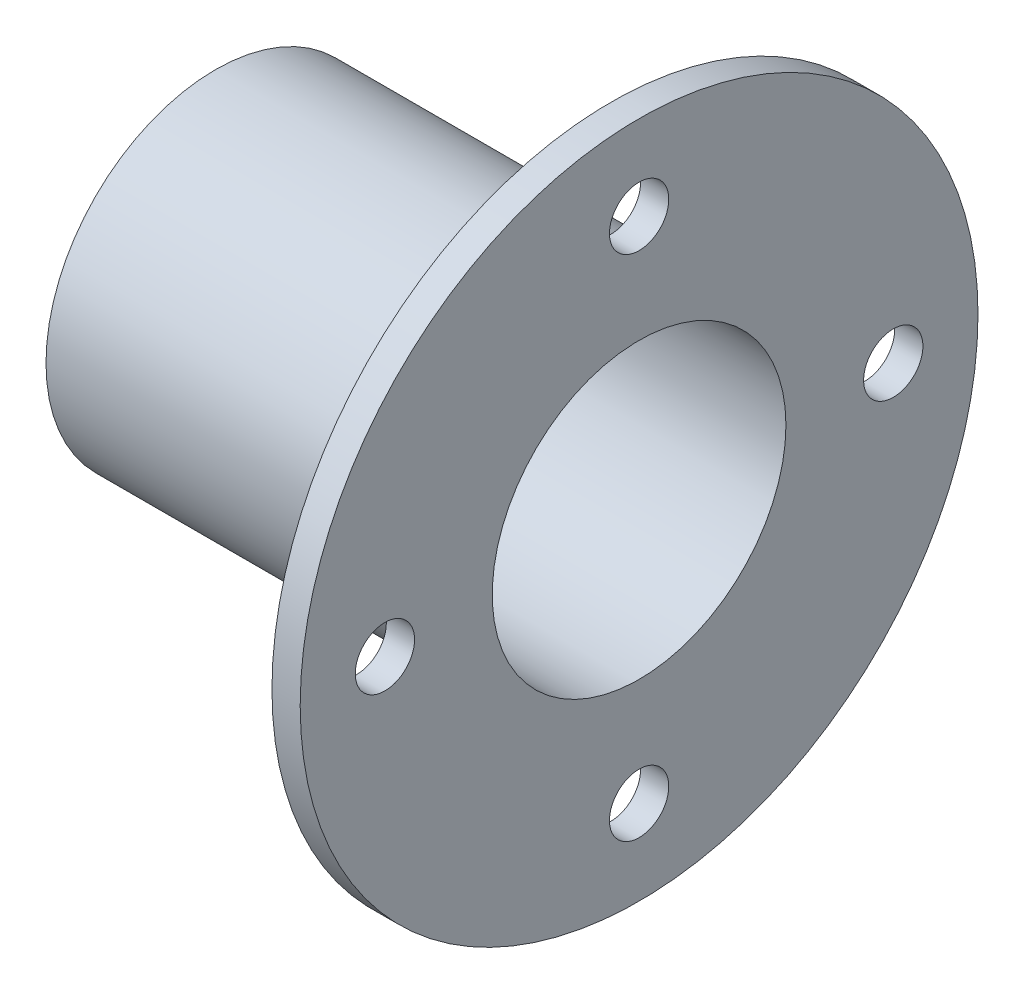
ISO-10303-21;
HEADER;
FILE_DESCRIPTION(('STEP AP214'),'2;1');
FILE_NAME('part.step','',(''),(''),'','','');
FILE_SCHEMA(('AUTOMOTIVE_DESIGN { 1 0 10303 214 1 1 1 1 }'));
ENDSEC;
DATA;
#1=APPLICATION_CONTEXT('core data for automotive mechanical design processes');
#2=APPLICATION_PROTOCOL_DEFINITION('international standard','automotive_design',2000,#1);
#3=PRODUCT_CONTEXT('',#1,'mechanical');
#4=PRODUCT('Part','Part','',(#3));
#5=PRODUCT_RELATED_PRODUCT_CATEGORY('part','',(#4));
#6=PRODUCT_DEFINITION_FORMATION('','',#4);
#7=PRODUCT_DEFINITION_CONTEXT('part definition',#1,'design');
#8=PRODUCT_DEFINITION('design','',#6,#7);
#9=PRODUCT_DEFINITION_SHAPE('','',#8);
#10=(LENGTH_UNIT() NAMED_UNIT(*) SI_UNIT(.MILLI.,.METRE.));
#11=(NAMED_UNIT(*) PLANE_ANGLE_UNIT() SI_UNIT($,.RADIAN.));
#12=(NAMED_UNIT(*) SI_UNIT($,.STERADIAN.) SOLID_ANGLE_UNIT());
#13=UNCERTAINTY_MEASURE_WITH_UNIT(LENGTH_MEASURE(1.E-05),#10,'distance_accuracy_value','');
#14=(GEOMETRIC_REPRESENTATION_CONTEXT(3) GLOBAL_UNCERTAINTY_ASSIGNED_CONTEXT((#13)) GLOBAL_UNIT_ASSIGNED_CONTEXT((#10,
#11,#12)) REPRESENTATION_CONTEXT('',''));
#15=CARTESIAN_POINT('',(0.,0.,0.));
#16=DIRECTION('',(0.,0.,1.));
#17=DIRECTION('',(1.,0.,0.));
#18=AXIS2_PLACEMENT_3D('',#15,#16,#17);
#19=CARTESIAN_POINT('',(0.,0.,0.));
#20=DIRECTION('',(1.,0.,0.));
#21=DIRECTION('',(0.,0.,-1.));
#22=AXIS2_PLACEMENT_3D('',#19,#20,#21);
#23=PLANE('',#22);
#24=CARTESIAN_POINT('',(0.,0.,0.));
#25=DIRECTION('',(1.,0.,0.));
#26=DIRECTION('',(0.,0.,-1.));
#27=AXIS2_PLACEMENT_3D('',#24,#25,#26);
#28=CIRCLE('',#27,30.);
#29=CARTESIAN_POINT('',(0.,0.,-30.));
#30=VERTEX_POINT('',#29);
#31=EDGE_CURVE('E34',#30,#30,#28,.T.);
#32=ORIENTED_EDGE('',*,*,#31,.F.);
#33=EDGE_LOOP('',(#32));
#34=FACE_BOUND('',#33,.T.);
#35=CARTESIAN_POINT('',(0.,0.,0.));
#36=DIRECTION('',(1.,0.,0.));
#37=DIRECTION('',(0.,0.,-1.));
#38=AXIS2_PLACEMENT_3D('',#35,#36,#37);
#39=CIRCLE('',#38,26.);
#40=CARTESIAN_POINT('',(0.,0.,-26.));
#41=VERTEX_POINT('',#40);
#42=EDGE_CURVE('E41',#41,#41,#39,.T.);
#43=ORIENTED_EDGE('',*,*,#42,.T.);
#44=EDGE_LOOP('',(#43));
#45=FACE_BOUND('',#44,.T.);
#46=ADVANCED_FACE('F30',(#34,#45),#23,.F.);
#47=CARTESIAN_POINT('',(70.,0.,0.));
#48=DIRECTION('',(-1.,0.,0.));
#49=DIRECTION('',(0.,0.,1.));
#50=AXIS2_PLACEMENT_3D('',#47,#48,#49);
#51=CYLINDRICAL_SURFACE('',#50,30.);
#52=CARTESIAN_POINT('',(70.,0.,0.));
#53=DIRECTION('',(1.,0.,0.));
#54=DIRECTION('',(0.,0.,-1.));
#55=AXIS2_PLACEMENT_3D('',#52,#53,#54);
#56=CIRCLE('',#55,30.);
#57=CARTESIAN_POINT('',(70.,0.,-30.));
#58=VERTEX_POINT('',#57);
#59=EDGE_CURVE('E10',#58,#58,#56,.T.);
#60=ORIENTED_EDGE('',*,*,#59,.F.);
#61=EDGE_LOOP('',(#60));
#62=FACE_BOUND('',#61,.T.);
#63=ORIENTED_EDGE('',*,*,#31,.T.);
#64=EDGE_LOOP('',(#63));
#65=FACE_BOUND('',#64,.T.);
#66=ADVANCED_FACE('F32',(#62,#65),#51,.T.);
#67=CARTESIAN_POINT('',(70.,0.,0.));
#68=DIRECTION('',(-1.,0.,0.));
#69=DIRECTION('',(0.,0.,1.));
#70=AXIS2_PLACEMENT_3D('',#67,#68,#69);
#71=CYLINDRICAL_SURFACE('',#70,26.);
#72=ORIENTED_EDGE('',*,*,#42,.F.);
#73=EDGE_LOOP('',(#72));
#74=FACE_BOUND('',#73,.T.);
#75=CARTESIAN_POINT('',(75.,0.,0.));
#76=DIRECTION('',(1.,0.,0.));
#77=DIRECTION('',(0.,0.,-1.));
#78=AXIS2_PLACEMENT_3D('',#75,#76,#77);
#79=CIRCLE('',#78,26.);
#80=CARTESIAN_POINT('',(75.,0.,-26.));
#81=VERTEX_POINT('',#80);
#82=EDGE_CURVE('E49',#81,#81,#79,.T.);
#83=ORIENTED_EDGE('',*,*,#82,.T.);
#84=EDGE_LOOP('',(#83));
#85=FACE_BOUND('',#84,.T.);
#86=ADVANCED_FACE('F97',(#74,#85),#71,.F.);
#87=CARTESIAN_POINT('',(70.,0.,0.));
#88=DIRECTION('',(1.,0.,0.));
#89=DIRECTION('',(0.,0.,-1.));
#90=AXIS2_PLACEMENT_3D('',#87,#88,#89);
#91=PLANE('',#90);
#92=CARTESIAN_POINT('',(70.,0.,-45.));
#93=DIRECTION('',(1.,0.,0.));
#94=DIRECTION('',(0.,0.,-1.));
#95=AXIS2_PLACEMENT_3D('',#92,#93,#94);
#96=CIRCLE('',#95,5.25);
#97=CARTESIAN_POINT('',(70.,0.,-50.25));
#98=VERTEX_POINT('',#97);
#99=EDGE_CURVE('E60',#98,#98,#96,.F.);
#100=ORIENTED_EDGE('',*,*,#99,.F.);
#101=EDGE_LOOP('',(#100));
#102=FACE_BOUND('',#101,.T.);
#103=CARTESIAN_POINT('',(70.,-45.,0.));
#104=DIRECTION('',(1.,0.,0.));
#105=DIRECTION('',(0.,0.,-1.));
#106=AXIS2_PLACEMENT_3D('',#103,#104,#105);
#107=CIRCLE('',#106,5.25);
#108=CARTESIAN_POINT('',(70.,-45.,-5.25));
#109=VERTEX_POINT('',#108);
#110=EDGE_CURVE('E68',#109,#109,#107,.F.);
#111=ORIENTED_EDGE('',*,*,#110,.F.);
#112=EDGE_LOOP('',(#111));
#113=FACE_BOUND('',#112,.T.);
#114=CARTESIAN_POINT('',(70.,45.,0.));
#115=DIRECTION('',(1.,0.,0.));
#116=DIRECTION('',(0.,0.,-1.));
#117=AXIS2_PLACEMENT_3D('',#114,#115,#116);
#118=CIRCLE('',#117,5.25);
#119=CARTESIAN_POINT('',(70.,45.,-5.24999999999998));
#120=VERTEX_POINT('',#119);
#121=EDGE_CURVE('E61',#120,#120,#118,.F.);
#122=ORIENTED_EDGE('',*,*,#121,.F.);
#123=EDGE_LOOP('',(#122));
#124=FACE_BOUND('',#123,.T.);
#125=CARTESIAN_POINT('',(70.,0.,45.));
#126=DIRECTION('',(1.,0.,0.));
#127=DIRECTION('',(0.,0.,-1.));
#128=AXIS2_PLACEMENT_3D('',#125,#126,#127);
#129=CIRCLE('',#128,5.25);
#130=CARTESIAN_POINT('',(70.,0.,39.75));
#131=VERTEX_POINT('',#130);
#132=EDGE_CURVE('E54',#131,#131,#129,.F.);
#133=ORIENTED_EDGE('',*,*,#132,.F.);
#134=EDGE_LOOP('',(#133));
#135=FACE_BOUND('',#134,.T.);
#136=CARTESIAN_POINT('',(70.,0.,0.));
#137=DIRECTION('',(1.,0.,0.));
#138=DIRECTION('',(0.,0.,-1.));
#139=AXIS2_PLACEMENT_3D('',#136,#137,#138);
#140=CIRCLE('',#139,60.);
#141=CARTESIAN_POINT('',(70.,0.,-60.));
#142=VERTEX_POINT('',#141);
#143=EDGE_CURVE('E46',#142,#142,#140,.T.);
#144=ORIENTED_EDGE('',*,*,#143,.F.);
#145=EDGE_LOOP('',(#144));
#146=FACE_BOUND('',#145,.T.);
#147=ORIENTED_EDGE('',*,*,#59,.T.);
#148=EDGE_LOOP('',(#147));
#149=FACE_BOUND('',#148,.T.);
#150=ADVANCED_FACE('F85',(#102,#113,#124,#135,#146,#149),#91,.F.);
#151=CARTESIAN_POINT('',(75.,0.,0.));
#152=DIRECTION('',(1.,0.,0.));
#153=DIRECTION('',(0.,0.,-1.));
#154=AXIS2_PLACEMENT_3D('',#151,#152,#153);
#155=PLANE('',#154);
#156=CARTESIAN_POINT('',(75.,0.,-45.));
#157=DIRECTION('',(1.,0.,0.));
#158=DIRECTION('',(0.,0.,-1.));
#159=AXIS2_PLACEMENT_3D('',#156,#157,#158);
#160=CIRCLE('',#159,5.25);
#161=CARTESIAN_POINT('',(75.,0.,-50.25));
#162=VERTEX_POINT('',#161);
#163=EDGE_CURVE('E71',#162,#162,#160,.T.);
#164=ORIENTED_EDGE('',*,*,#163,.F.);
#165=EDGE_LOOP('',(#164));
#166=FACE_BOUND('',#165,.T.);
#167=CARTESIAN_POINT('',(75.,-45.,0.));
#168=DIRECTION('',(1.,0.,0.));
#169=DIRECTION('',(0.,0.,-1.));
#170=AXIS2_PLACEMENT_3D('',#167,#168,#169);
#171=CIRCLE('',#170,5.25);
#172=CARTESIAN_POINT('',(75.,-45.,-5.25));
#173=VERTEX_POINT('',#172);
#174=EDGE_CURVE('E64',#173,#173,#171,.T.);
#175=ORIENTED_EDGE('',*,*,#174,.F.);
#176=EDGE_LOOP('',(#175));
#177=FACE_BOUND('',#176,.T.);
#178=CARTESIAN_POINT('',(75.,45.,0.));
#179=DIRECTION('',(1.,0.,0.));
#180=DIRECTION('',(0.,0.,-1.));
#181=AXIS2_PLACEMENT_3D('',#178,#179,#180);
#182=CIRCLE('',#181,5.25);
#183=CARTESIAN_POINT('',(75.,45.,-5.24999999999998));
#184=VERTEX_POINT('',#183);
#185=EDGE_CURVE('E65',#184,#184,#182,.T.);
#186=ORIENTED_EDGE('',*,*,#185,.F.);
#187=EDGE_LOOP('',(#186));
#188=FACE_BOUND('',#187,.T.);
#189=CARTESIAN_POINT('',(75.,0.,45.));
#190=DIRECTION('',(1.,0.,0.));
#191=DIRECTION('',(0.,0.,-1.));
#192=AXIS2_PLACEMENT_3D('',#189,#190,#191);
#193=CIRCLE('',#192,5.25);
#194=CARTESIAN_POINT('',(75.,0.,39.75));
#195=VERTEX_POINT('',#194);
#196=EDGE_CURVE('E57',#195,#195,#193,.T.);
#197=ORIENTED_EDGE('',*,*,#196,.F.);
#198=EDGE_LOOP('',(#197));
#199=FACE_BOUND('',#198,.T.);
#200=CARTESIAN_POINT('',(75.,0.,0.));
#201=DIRECTION('',(1.,0.,0.));
#202=DIRECTION('',(0.,0.,-1.));
#203=AXIS2_PLACEMENT_3D('',#200,#201,#202);
#204=CIRCLE('',#203,60.);
#205=CARTESIAN_POINT('',(75.,0.,-60.));
#206=VERTEX_POINT('',#205);
#207=EDGE_CURVE('E45',#206,#206,#204,.T.);
#208=ORIENTED_EDGE('',*,*,#207,.T.);
#209=EDGE_LOOP('',(#208));
#210=FACE_BOUND('',#209,.T.);
#211=ORIENTED_EDGE('',*,*,#82,.F.);
#212=EDGE_LOOP('',(#211));
#213=FACE_BOUND('',#212,.T.);
#214=ADVANCED_FACE('F81',(#166,#177,#188,#199,#210,#213),#155,.T.);
#215=CARTESIAN_POINT('',(75.,0.,0.));
#216=DIRECTION('',(-1.,0.,0.));
#217=DIRECTION('',(0.,0.,1.));
#218=AXIS2_PLACEMENT_3D('',#215,#216,#217);
#219=CYLINDRICAL_SURFACE('',#218,60.);
#220=ORIENTED_EDGE('',*,*,#207,.F.);
#221=EDGE_LOOP('',(#220));
#222=FACE_BOUND('',#221,.T.);
#223=ORIENTED_EDGE('',*,*,#143,.T.);
#224=EDGE_LOOP('',(#223));
#225=FACE_BOUND('',#224,.T.);
#226=ADVANCED_FACE('F84',(#222,#225),#219,.T.);
#227=CARTESIAN_POINT('',(55.1507575950825,0.,45.));
#228=DIRECTION('',(1.,0.,0.));
#229=DIRECTION('',(0.,0.,-1.));
#230=AXIS2_PLACEMENT_3D('',#227,#228,#229);
#231=CYLINDRICAL_SURFACE('',#230,5.25);
#232=ORIENTED_EDGE('',*,*,#132,.T.);
#233=EDGE_LOOP('',(#232));
#234=FACE_BOUND('',#233,.T.);
#235=ORIENTED_EDGE('',*,*,#196,.T.);
#236=EDGE_LOOP('',(#235));
#237=FACE_BOUND('',#236,.T.);
#238=ADVANCED_FACE('F136',(#234,#237),#231,.F.);
#239=CARTESIAN_POINT('',(55.1507575950825,45.,0.));
#240=DIRECTION('',(1.,0.,0.));
#241=DIRECTION('',(0.,0.,-1.));
#242=AXIS2_PLACEMENT_3D('',#239,#240,#241);
#243=CYLINDRICAL_SURFACE('',#242,5.25);
#244=ORIENTED_EDGE('',*,*,#121,.T.);
#245=EDGE_LOOP('',(#244));
#246=FACE_BOUND('',#245,.T.);
#247=ORIENTED_EDGE('',*,*,#185,.T.);
#248=EDGE_LOOP('',(#247));
#249=FACE_BOUND('',#248,.T.);
#250=ADVANCED_FACE('F156',(#246,#249),#243,.F.);
#251=CARTESIAN_POINT('',(55.1507575950825,-45.,0.));
#252=DIRECTION('',(1.,0.,0.));
#253=DIRECTION('',(0.,0.,-1.));
#254=AXIS2_PLACEMENT_3D('',#251,#252,#253);
#255=CYLINDRICAL_SURFACE('',#254,5.25);
#256=ORIENTED_EDGE('',*,*,#110,.T.);
#257=EDGE_LOOP('',(#256));
#258=FACE_BOUND('',#257,.T.);
#259=ORIENTED_EDGE('',*,*,#174,.T.);
#260=EDGE_LOOP('',(#259));
#261=FACE_BOUND('',#260,.T.);
#262=ADVANCED_FACE('F166',(#258,#261),#255,.F.);
#263=CARTESIAN_POINT('',(55.1507575950825,0.,-45.));
#264=DIRECTION('',(1.,0.,0.));
#265=DIRECTION('',(0.,0.,-1.));
#266=AXIS2_PLACEMENT_3D('',#263,#264,#265);
#267=CYLINDRICAL_SURFACE('',#266,5.25);
#268=ORIENTED_EDGE('',*,*,#99,.T.);
#269=EDGE_LOOP('',(#268));
#270=FACE_BOUND('',#269,.T.);
#271=ORIENTED_EDGE('',*,*,#163,.T.);
#272=EDGE_LOOP('',(#271));
#273=FACE_BOUND('',#272,.T.);
#274=ADVANCED_FACE('F79',(#270,#273),#267,.F.);
#275=CLOSED_SHELL('',(#46,#66,#86,#150,#214,#226,#238,#250,#262,#274));
#276=MANIFOLD_SOLID_BREP('B2',#275);
#277=ADVANCED_BREP_SHAPE_REPRESENTATION('',(#18,#276),#14);
#278=SHAPE_DEFINITION_REPRESENTATION(#9,#277);
ENDSEC;
END-ISO-10303-21;
